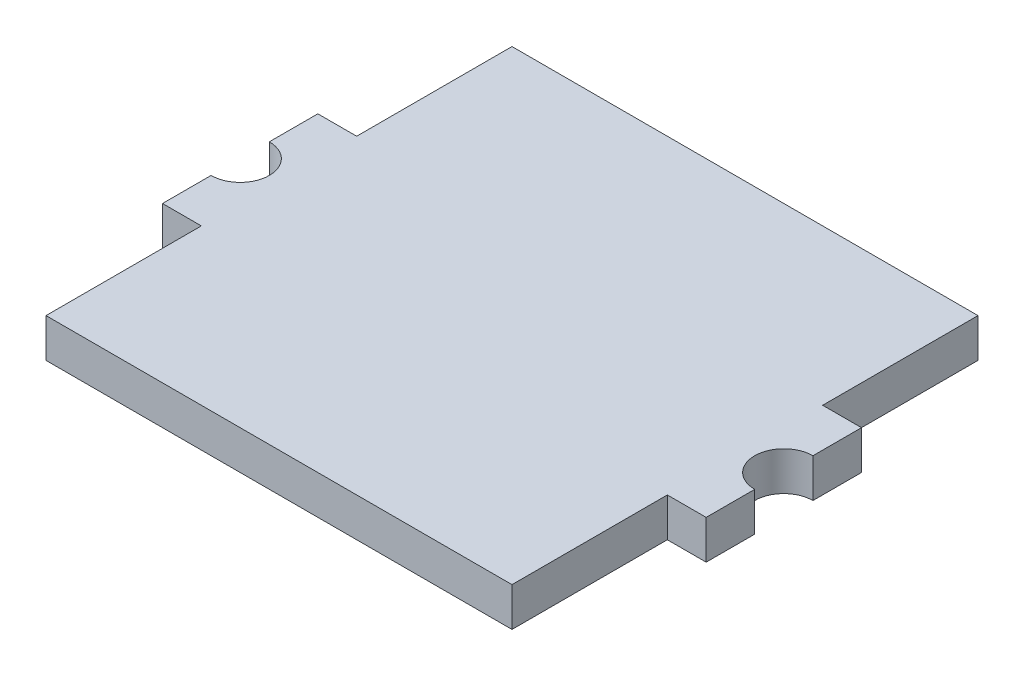
ISO-10303-21;
HEADER;
FILE_DESCRIPTION(('STEP AP214'),'2;1');
FILE_NAME('part.step','',(''),(''),'','','');
FILE_SCHEMA(('AUTOMOTIVE_DESIGN { 1 0 10303 214 1 1 1 1 }'));
ENDSEC;
DATA;
#1=APPLICATION_CONTEXT('core data for automotive mechanical design processes');
#2=APPLICATION_PROTOCOL_DEFINITION('international standard','automotive_design',2000,#1);
#3=PRODUCT_CONTEXT('',#1,'mechanical');
#4=PRODUCT('Part','Part','',(#3));
#5=PRODUCT_RELATED_PRODUCT_CATEGORY('part','',(#4));
#6=PRODUCT_DEFINITION_FORMATION('','',#4);
#7=PRODUCT_DEFINITION_CONTEXT('part definition',#1,'design');
#8=PRODUCT_DEFINITION('design','',#6,#7);
#9=PRODUCT_DEFINITION_SHAPE('','',#8);
#10=(LENGTH_UNIT() NAMED_UNIT(*) SI_UNIT(.MILLI.,.METRE.));
#11=(NAMED_UNIT(*) PLANE_ANGLE_UNIT() SI_UNIT($,.RADIAN.));
#12=(NAMED_UNIT(*) SI_UNIT($,.STERADIAN.) SOLID_ANGLE_UNIT());
#13=UNCERTAINTY_MEASURE_WITH_UNIT(LENGTH_MEASURE(1.E-05),#10,'distance_accuracy_value','');
#14=(GEOMETRIC_REPRESENTATION_CONTEXT(3) GLOBAL_UNCERTAINTY_ASSIGNED_CONTEXT((#13)) GLOBAL_UNIT_ASSIGNED_CONTEXT((#10,
#11,#12)) REPRESENTATION_CONTEXT('',''));
#15=CARTESIAN_POINT('',(0.,0.,0.));
#16=DIRECTION('',(0.,0.,1.));
#17=DIRECTION('',(1.,0.,0.));
#18=AXIS2_PLACEMENT_3D('',#15,#16,#17);
#19=CARTESIAN_POINT('',(38.1,3.175,0.));
#20=DIRECTION('',(0.,0.,-1.));
#21=DIRECTION('',(-1.,0.,0.));
#22=AXIS2_PLACEMENT_3D('',#19,#20,#21);
#23=PLANE('',#22);
#24=DIRECTION('',(1.,0.,0.));
#25=VECTOR('',#24,1.);
#26=CARTESIAN_POINT('',(38.1,0.,0.));
#27=LINE('',#26,#25);
#28=CARTESIAN_POINT('',(0.,0.,0.));
#29=VERTEX_POINT('',#28);
#30=CARTESIAN_POINT('',(38.1,0.,0.));
#31=VERTEX_POINT('',#30);
#32=EDGE_CURVE('E177',#29,#31,#27,.T.);
#33=ORIENTED_EDGE('',*,*,#32,.T.);
#34=DIRECTION('',(0.,-1.,0.));
#35=VECTOR('',#34,1.);
#36=CARTESIAN_POINT('',(38.1,3.175,0.));
#37=LINE('',#36,#35);
#38=CARTESIAN_POINT('',(38.1,3.175,0.));
#39=VERTEX_POINT('',#38);
#40=EDGE_CURVE('E11',#39,#31,#37,.T.);
#41=ORIENTED_EDGE('',*,*,#40,.F.);
#42=DIRECTION('',(1.,0.,0.));
#43=VECTOR('',#42,1.);
#44=CARTESIAN_POINT('',(38.1,3.175,0.));
#45=LINE('',#44,#43);
#46=CARTESIAN_POINT('',(0.,3.175,0.));
#47=VERTEX_POINT('',#46);
#48=EDGE_CURVE('E207',#47,#39,#45,.T.);
#49=ORIENTED_EDGE('',*,*,#48,.F.);
#50=DIRECTION('',(0.,-1.,0.));
#51=VECTOR('',#50,1.);
#52=CARTESIAN_POINT('',(0.,3.175,0.));
#53=LINE('',#52,#51);
#54=EDGE_CURVE('E173',#47,#29,#53,.T.);
#55=ORIENTED_EDGE('',*,*,#54,.T.);
#56=EDGE_LOOP('',(#33,#41,#49,#55));
#57=FACE_BOUND('',#56,.T.);
#58=ADVANCED_FACE('F33',(#57),#23,.F.);
#59=CARTESIAN_POINT('',(38.1,3.175,-12.7));
#60=DIRECTION('',(-1.,0.,0.));
#61=DIRECTION('',(0.,0.,1.));
#62=AXIS2_PLACEMENT_3D('',#59,#60,#61);
#63=PLANE('',#62);
#64=DIRECTION('',(0.,0.,-1.));
#65=VECTOR('',#64,1.);
#66=CARTESIAN_POINT('',(38.1,0.,-12.7));
#67=LINE('',#66,#65);
#68=CARTESIAN_POINT('',(38.1,0.,-12.7));
#69=VERTEX_POINT('',#68);
#70=EDGE_CURVE('E180',#31,#69,#67,.T.);
#71=ORIENTED_EDGE('',*,*,#70,.T.);
#72=DIRECTION('',(0.,-1.,0.));
#73=VECTOR('',#72,1.);
#74=CARTESIAN_POINT('',(38.1,3.175,-12.7));
#75=LINE('',#74,#73);
#76=CARTESIAN_POINT('',(38.1,3.175,-12.7));
#77=VERTEX_POINT('',#76);
#78=EDGE_CURVE('E41',#77,#69,#75,.T.);
#79=ORIENTED_EDGE('',*,*,#78,.F.);
#80=DIRECTION('',(0.,0.,-1.));
#81=VECTOR('',#80,1.);
#82=CARTESIAN_POINT('',(38.1,3.175,-12.7));
#83=LINE('',#82,#81);
#84=EDGE_CURVE('E116',#39,#77,#83,.T.);
#85=ORIENTED_EDGE('',*,*,#84,.F.);
#86=ORIENTED_EDGE('',*,*,#40,.T.);
#87=EDGE_LOOP('',(#71,#79,#85,#86));
#88=FACE_BOUND('',#87,.T.);
#89=ADVANCED_FACE('F305',(#88),#63,.F.);
#90=CARTESIAN_POINT('',(38.1,3.175,-12.7));
#91=DIRECTION('',(0.,0.,-1.));
#92=DIRECTION('',(-1.,0.,0.));
#93=AXIS2_PLACEMENT_3D('',#90,#91,#92);
#94=PLANE('',#93);
#95=DIRECTION('',(1.,0.,0.));
#96=VECTOR('',#95,1.);
#97=CARTESIAN_POINT('',(38.1,0.,-12.7));
#98=LINE('',#97,#96);
#99=CARTESIAN_POINT('',(41.275,0.,-12.7));
#100=VERTEX_POINT('',#99);
#101=EDGE_CURVE('E182',#69,#100,#98,.T.);
#102=ORIENTED_EDGE('',*,*,#101,.T.);
#103=DIRECTION('',(0.,-1.,0.));
#104=VECTOR('',#103,1.);
#105=CARTESIAN_POINT('',(41.275,3.175,-12.7));
#106=LINE('',#105,#104);
#107=CARTESIAN_POINT('',(41.275,3.175,-12.7));
#108=VERTEX_POINT('',#107);
#109=EDGE_CURVE('E238',#108,#100,#106,.T.);
#110=ORIENTED_EDGE('',*,*,#109,.F.);
#111=DIRECTION('',(1.,0.,0.));
#112=VECTOR('',#111,1.);
#113=CARTESIAN_POINT('',(38.1,3.175,-12.7));
#114=LINE('',#113,#112);
#115=EDGE_CURVE('E246',#77,#108,#114,.T.);
#116=ORIENTED_EDGE('',*,*,#115,.F.);
#117=ORIENTED_EDGE('',*,*,#78,.T.);
#118=EDGE_LOOP('',(#102,#110,#116,#117));
#119=FACE_BOUND('',#118,.T.);
#120=ADVANCED_FACE('F244',(#119),#94,.F.);
#121=CARTESIAN_POINT('',(41.275,3.175,-12.7));
#122=DIRECTION('',(-1.,0.,0.));
#123=DIRECTION('',(0.,0.,1.));
#124=AXIS2_PLACEMENT_3D('',#121,#122,#123);
#125=PLANE('',#124);
#126=DIRECTION('',(0.,0.,-1.));
#127=VECTOR('',#126,1.);
#128=CARTESIAN_POINT('',(41.275,0.,-12.7));
#129=LINE('',#128,#127);
#130=CARTESIAN_POINT('',(41.275,0.,-16.66875));
#131=VERTEX_POINT('',#130);
#132=EDGE_CURVE('E184',#100,#131,#129,.T.);
#133=ORIENTED_EDGE('',*,*,#132,.T.);
#134=DIRECTION('',(0.,-1.,0.));
#135=VECTOR('',#134,1.);
#136=CARTESIAN_POINT('',(41.275,3.175,-16.66875));
#137=LINE('',#136,#135);
#138=CARTESIAN_POINT('',(41.275,3.175,-16.66875));
#139=VERTEX_POINT('',#138);
#140=EDGE_CURVE('E235',#139,#131,#137,.T.);
#141=ORIENTED_EDGE('',*,*,#140,.F.);
#142=DIRECTION('',(0.,0.,-1.));
#143=VECTOR('',#142,1.);
#144=CARTESIAN_POINT('',(41.275,3.175,-12.7));
#145=LINE('',#144,#143);
#146=EDGE_CURVE('E264',#108,#139,#145,.T.);
#147=ORIENTED_EDGE('',*,*,#146,.F.);
#148=ORIENTED_EDGE('',*,*,#109,.T.);
#149=EDGE_LOOP('',(#133,#141,#147,#148));
#150=FACE_BOUND('',#149,.T.);
#151=ADVANCED_FACE('F255',(#150),#125,.F.);
#152=CARTESIAN_POINT('',(41.275,3.175,-19.05));
#153=DIRECTION('',(0.,-1.,0.));
#154=DIRECTION('',(0.,0.,-1.));
#155=AXIS2_PLACEMENT_3D('',#152,#153,#154);
#156=CYLINDRICAL_SURFACE('',#155,2.38125);
#157=CARTESIAN_POINT('',(41.275,0.,-19.05));
#158=DIRECTION('',(0.,-1.,0.));
#159=DIRECTION('',(0.,0.,-1.));
#160=AXIS2_PLACEMENT_3D('',#157,#158,#159);
#161=CIRCLE('',#160,2.38125);
#162=CARTESIAN_POINT('',(41.275,0.,-21.43125));
#163=VERTEX_POINT('',#162);
#164=EDGE_CURVE('E186',#131,#163,#161,.T.);
#165=ORIENTED_EDGE('',*,*,#164,.T.);
#166=DIRECTION('',(0.,-1.,0.));
#167=VECTOR('',#166,1.);
#168=CARTESIAN_POINT('',(41.275,3.175,-21.43125));
#169=LINE('',#168,#167);
#170=CARTESIAN_POINT('',(41.275,3.175,-21.43125));
#171=VERTEX_POINT('',#170);
#172=EDGE_CURVE('E232',#171,#163,#169,.T.);
#173=ORIENTED_EDGE('',*,*,#172,.F.);
#174=CARTESIAN_POINT('',(41.275,3.175,-19.05));
#175=DIRECTION('',(0.,-1.,0.));
#176=DIRECTION('',(0.,0.,-1.));
#177=AXIS2_PLACEMENT_3D('',#174,#175,#176);
#178=CIRCLE('',#177,2.38125);
#179=EDGE_CURVE('E261',#139,#171,#178,.T.);
#180=ORIENTED_EDGE('',*,*,#179,.F.);
#181=ORIENTED_EDGE('',*,*,#140,.T.);
#182=EDGE_LOOP('',(#165,#173,#180,#181));
#183=FACE_BOUND('',#182,.T.);
#184=ADVANCED_FACE('F259',(#183),#156,.F.);
#185=CARTESIAN_POINT('',(41.275,3.175,-21.43125));
#186=DIRECTION('',(-1.,0.,0.));
#187=DIRECTION('',(0.,0.,1.));
#188=AXIS2_PLACEMENT_3D('',#185,#186,#187);
#189=PLANE('',#188);
#190=DIRECTION('',(0.,0.,-1.));
#191=VECTOR('',#190,1.);
#192=CARTESIAN_POINT('',(41.275,0.,-21.43125));
#193=LINE('',#192,#191);
#194=CARTESIAN_POINT('',(41.275,0.,-25.4));
#195=VERTEX_POINT('',#194);
#196=EDGE_CURVE('E188',#163,#195,#193,.T.);
#197=ORIENTED_EDGE('',*,*,#196,.T.);
#198=DIRECTION('',(0.,-1.,0.));
#199=VECTOR('',#198,1.);
#200=CARTESIAN_POINT('',(41.275,3.175,-25.4));
#201=LINE('',#200,#199);
#202=CARTESIAN_POINT('',(41.275,3.175,-25.4));
#203=VERTEX_POINT('',#202);
#204=EDGE_CURVE('E229',#203,#195,#201,.T.);
#205=ORIENTED_EDGE('',*,*,#204,.F.);
#206=DIRECTION('',(0.,0.,-1.));
#207=VECTOR('',#206,1.);
#208=CARTESIAN_POINT('',(41.275,3.175,-21.43125));
#209=LINE('',#208,#207);
#210=EDGE_CURVE('E263',#171,#203,#209,.T.);
#211=ORIENTED_EDGE('',*,*,#210,.F.);
#212=ORIENTED_EDGE('',*,*,#172,.T.);
#213=EDGE_LOOP('',(#197,#205,#211,#212));
#214=FACE_BOUND('',#213,.T.);
#215=ADVANCED_FACE('F318',(#214),#189,.F.);
#216=CARTESIAN_POINT('',(41.275,3.175,-25.4));
#217=DIRECTION('',(0.,0.,1.));
#218=DIRECTION('',(1.,0.,0.));
#219=AXIS2_PLACEMENT_3D('',#216,#217,#218);
#220=PLANE('',#219);
#221=DIRECTION('',(-1.,0.,0.));
#222=VECTOR('',#221,1.);
#223=CARTESIAN_POINT('',(41.275,0.,-25.4));
#224=LINE('',#223,#222);
#225=CARTESIAN_POINT('',(38.1,0.,-25.4));
#226=VERTEX_POINT('',#225);
#227=EDGE_CURVE('E190',#195,#226,#224,.T.);
#228=ORIENTED_EDGE('',*,*,#227,.T.);
#229=DIRECTION('',(0.,-1.,0.));
#230=VECTOR('',#229,1.);
#231=CARTESIAN_POINT('',(38.1,3.175,-25.4));
#232=LINE('',#231,#230);
#233=CARTESIAN_POINT('',(38.1,3.175,-25.4));
#234=VERTEX_POINT('',#233);
#235=EDGE_CURVE('E226',#234,#226,#232,.T.);
#236=ORIENTED_EDGE('',*,*,#235,.F.);
#237=DIRECTION('',(-1.,0.,0.));
#238=VECTOR('',#237,1.);
#239=CARTESIAN_POINT('',(41.275,3.175,-25.4));
#240=LINE('',#239,#238);
#241=EDGE_CURVE('E266',#203,#234,#240,.T.);
#242=ORIENTED_EDGE('',*,*,#241,.F.);
#243=ORIENTED_EDGE('',*,*,#204,.T.);
#244=EDGE_LOOP('',(#228,#236,#242,#243));
#245=FACE_BOUND('',#244,.T.);
#246=ADVANCED_FACE('F321',(#245),#220,.F.);
#247=CARTESIAN_POINT('',(38.1,3.175,-38.1));
#248=DIRECTION('',(-1.,0.,0.));
#249=DIRECTION('',(0.,0.,1.));
#250=AXIS2_PLACEMENT_3D('',#247,#248,#249);
#251=PLANE('',#250);
#252=DIRECTION('',(0.,0.,-1.));
#253=VECTOR('',#252,1.);
#254=CARTESIAN_POINT('',(38.1,0.,-38.1));
#255=LINE('',#254,#253);
#256=CARTESIAN_POINT('',(38.1,0.,-38.1));
#257=VERTEX_POINT('',#256);
#258=EDGE_CURVE('E192',#226,#257,#255,.T.);
#259=ORIENTED_EDGE('',*,*,#258,.T.);
#260=DIRECTION('',(0.,-1.,0.));
#261=VECTOR('',#260,1.);
#262=CARTESIAN_POINT('',(38.1,3.175,-38.1));
#263=LINE('',#262,#261);
#264=CARTESIAN_POINT('',(38.1,3.175,-38.1));
#265=VERTEX_POINT('',#264);
#266=EDGE_CURVE('E223',#265,#257,#263,.T.);
#267=ORIENTED_EDGE('',*,*,#266,.F.);
#268=DIRECTION('',(0.,0.,-1.));
#269=VECTOR('',#268,1.);
#270=CARTESIAN_POINT('',(38.1,3.175,-38.1));
#271=LINE('',#270,#269);
#272=EDGE_CURVE('E272',#234,#265,#271,.T.);
#273=ORIENTED_EDGE('',*,*,#272,.F.);
#274=ORIENTED_EDGE('',*,*,#235,.T.);
#275=EDGE_LOOP('',(#259,#267,#273,#274));
#276=FACE_BOUND('',#275,.T.);
#277=ADVANCED_FACE('F325',(#276),#251,.F.);
#278=CARTESIAN_POINT('',(0.,3.175,-38.1));
#279=DIRECTION('',(0.,0.,1.));
#280=DIRECTION('',(1.,0.,0.));
#281=AXIS2_PLACEMENT_3D('',#278,#279,#280);
#282=PLANE('',#281);
#283=DIRECTION('',(-1.,0.,0.));
#284=VECTOR('',#283,1.);
#285=CARTESIAN_POINT('',(0.,0.,-38.1));
#286=LINE('',#285,#284);
#287=CARTESIAN_POINT('',(0.,0.,-38.1));
#288=VERTEX_POINT('',#287);
#289=EDGE_CURVE('E194',#257,#288,#286,.T.);
#290=ORIENTED_EDGE('',*,*,#289,.T.);
#291=DIRECTION('',(0.,-1.,0.));
#292=VECTOR('',#291,1.);
#293=CARTESIAN_POINT('',(0.,3.175,-38.1));
#294=LINE('',#293,#292);
#295=CARTESIAN_POINT('',(0.,3.175,-38.1));
#296=VERTEX_POINT('',#295);
#297=EDGE_CURVE('E220',#296,#288,#294,.T.);
#298=ORIENTED_EDGE('',*,*,#297,.F.);
#299=DIRECTION('',(-1.,0.,0.));
#300=VECTOR('',#299,1.);
#301=CARTESIAN_POINT('',(0.,3.175,-38.1));
#302=LINE('',#301,#300);
#303=EDGE_CURVE('E274',#265,#296,#302,.T.);
#304=ORIENTED_EDGE('',*,*,#303,.F.);
#305=ORIENTED_EDGE('',*,*,#266,.T.);
#306=EDGE_LOOP('',(#290,#298,#304,#305));
#307=FACE_BOUND('',#306,.T.);
#308=ADVANCED_FACE('F329',(#307),#282,.F.);
#309=CARTESIAN_POINT('',(0.,3.175,-25.4));
#310=DIRECTION('',(1.,0.,0.));
#311=DIRECTION('',(0.,0.,-1.));
#312=AXIS2_PLACEMENT_3D('',#309,#310,#311);
#313=PLANE('',#312);
#314=DIRECTION('',(0.,0.,1.));
#315=VECTOR('',#314,1.);
#316=CARTESIAN_POINT('',(0.,0.,-25.4));
#317=LINE('',#316,#315);
#318=CARTESIAN_POINT('',(0.,0.,-25.4));
#319=VERTEX_POINT('',#318);
#320=EDGE_CURVE('E196',#288,#319,#317,.T.);
#321=ORIENTED_EDGE('',*,*,#320,.T.);
#322=DIRECTION('',(0.,-1.,0.));
#323=VECTOR('',#322,1.);
#324=CARTESIAN_POINT('',(0.,3.175,-25.4));
#325=LINE('',#324,#323);
#326=CARTESIAN_POINT('',(0.,3.175,-25.4));
#327=VERTEX_POINT('',#326);
#328=EDGE_CURVE('E217',#327,#319,#325,.T.);
#329=ORIENTED_EDGE('',*,*,#328,.F.);
#330=DIRECTION('',(0.,0.,1.));
#331=VECTOR('',#330,1.);
#332=CARTESIAN_POINT('',(0.,3.175,-25.4));
#333=LINE('',#332,#331);
#334=EDGE_CURVE('E276',#296,#327,#333,.T.);
#335=ORIENTED_EDGE('',*,*,#334,.F.);
#336=ORIENTED_EDGE('',*,*,#297,.T.);
#337=EDGE_LOOP('',(#321,#329,#335,#336));
#338=FACE_BOUND('',#337,.T.);
#339=ADVANCED_FACE('F333',(#338),#313,.F.);
#340=CARTESIAN_POINT('',(0.,3.175,-25.4));
#341=DIRECTION('',(0.,0.,1.));
#342=DIRECTION('',(1.,0.,0.));
#343=AXIS2_PLACEMENT_3D('',#340,#341,#342);
#344=PLANE('',#343);
#345=DIRECTION('',(-1.,0.,0.));
#346=VECTOR('',#345,1.);
#347=CARTESIAN_POINT('',(0.,0.,-25.4));
#348=LINE('',#347,#346);
#349=CARTESIAN_POINT('',(-3.175,0.,-25.4));
#350=VERTEX_POINT('',#349);
#351=EDGE_CURVE('E198',#319,#350,#348,.T.);
#352=ORIENTED_EDGE('',*,*,#351,.T.);
#353=DIRECTION('',(0.,-1.,0.));
#354=VECTOR('',#353,1.);
#355=CARTESIAN_POINT('',(-3.175,3.175,-25.4));
#356=LINE('',#355,#354);
#357=CARTESIAN_POINT('',(-3.175,3.175,-25.4));
#358=VERTEX_POINT('',#357);
#359=EDGE_CURVE('E214',#358,#350,#356,.T.);
#360=ORIENTED_EDGE('',*,*,#359,.F.);
#361=DIRECTION('',(-1.,0.,0.));
#362=VECTOR('',#361,1.);
#363=CARTESIAN_POINT('',(0.,3.175,-25.4));
#364=LINE('',#363,#362);
#365=EDGE_CURVE('E278',#327,#358,#364,.T.);
#366=ORIENTED_EDGE('',*,*,#365,.F.);
#367=ORIENTED_EDGE('',*,*,#328,.T.);
#368=EDGE_LOOP('',(#352,#360,#366,#367));
#369=FACE_BOUND('',#368,.T.);
#370=ADVANCED_FACE('F337',(#369),#344,.F.);
#371=CARTESIAN_POINT('',(-3.175,3.175,-25.4));
#372=DIRECTION('',(1.,0.,0.));
#373=DIRECTION('',(0.,0.,-1.));
#374=AXIS2_PLACEMENT_3D('',#371,#372,#373);
#375=PLANE('',#374);
#376=DIRECTION('',(0.,0.,1.));
#377=VECTOR('',#376,1.);
#378=CARTESIAN_POINT('',(-3.175,0.,-25.4));
#379=LINE('',#378,#377);
#380=CARTESIAN_POINT('',(-3.175,0.,-21.43125));
#381=VERTEX_POINT('',#380);
#382=EDGE_CURVE('E200',#350,#381,#379,.T.);
#383=ORIENTED_EDGE('',*,*,#382,.T.);
#384=DIRECTION('',(0.,-1.,0.));
#385=VECTOR('',#384,1.);
#386=CARTESIAN_POINT('',(-3.175,3.175,-21.43125));
#387=LINE('',#386,#385);
#388=CARTESIAN_POINT('',(-3.175,3.175,-21.43125));
#389=VERTEX_POINT('',#388);
#390=EDGE_CURVE('E211',#389,#381,#387,.T.);
#391=ORIENTED_EDGE('',*,*,#390,.F.);
#392=DIRECTION('',(0.,0.,1.));
#393=VECTOR('',#392,1.);
#394=CARTESIAN_POINT('',(-3.175,3.175,-25.4));
#395=LINE('',#394,#393);
#396=EDGE_CURVE('E280',#358,#389,#395,.T.);
#397=ORIENTED_EDGE('',*,*,#396,.F.);
#398=ORIENTED_EDGE('',*,*,#359,.T.);
#399=EDGE_LOOP('',(#383,#391,#397,#398));
#400=FACE_BOUND('',#399,.T.);
#401=ADVANCED_FACE('F286',(#400),#375,.F.);
#402=CARTESIAN_POINT('',(-3.175,3.175,-19.05));
#403=DIRECTION('',(0.,-1.,0.));
#404=DIRECTION('',(0.,0.,-1.));
#405=AXIS2_PLACEMENT_3D('',#402,#403,#404);
#406=CYLINDRICAL_SURFACE('',#405,2.38125);
#407=CARTESIAN_POINT('',(-3.175,0.,-19.05));
#408=DIRECTION('',(0.,-1.,0.));
#409=DIRECTION('',(0.,0.,-1.));
#410=AXIS2_PLACEMENT_3D('',#407,#408,#409);
#411=CIRCLE('',#410,2.38125);
#412=CARTESIAN_POINT('',(-3.175,0.,-16.66875));
#413=VERTEX_POINT('',#412);
#414=EDGE_CURVE('E202',#381,#413,#411,.T.);
#415=ORIENTED_EDGE('',*,*,#414,.T.);
#416=DIRECTION('',(0.,-1.,0.));
#417=VECTOR('',#416,1.);
#418=CARTESIAN_POINT('',(-3.175,3.175,-16.66875));
#419=LINE('',#418,#417);
#420=CARTESIAN_POINT('',(-3.175,3.175,-16.66875));
#421=VERTEX_POINT('',#420);
#422=EDGE_CURVE('E168',#421,#413,#419,.T.);
#423=ORIENTED_EDGE('',*,*,#422,.F.);
#424=CARTESIAN_POINT('',(-3.175,3.175,-19.05));
#425=DIRECTION('',(0.,-1.,0.));
#426=DIRECTION('',(0.,0.,-1.));
#427=AXIS2_PLACEMENT_3D('',#424,#425,#426);
#428=CIRCLE('',#427,2.38125);
#429=EDGE_CURVE('E159',#389,#421,#428,.T.);
#430=ORIENTED_EDGE('',*,*,#429,.F.);
#431=ORIENTED_EDGE('',*,*,#390,.T.);
#432=EDGE_LOOP('',(#415,#423,#430,#431));
#433=FACE_BOUND('',#432,.T.);
#434=ADVANCED_FACE('F290',(#433),#406,.F.);
#435=CARTESIAN_POINT('',(-3.175,3.175,-16.66875));
#436=DIRECTION('',(1.,0.,0.));
#437=DIRECTION('',(0.,0.,-1.));
#438=AXIS2_PLACEMENT_3D('',#435,#436,#437);
#439=PLANE('',#438);
#440=DIRECTION('',(0.,0.,1.));
#441=VECTOR('',#440,1.);
#442=CARTESIAN_POINT('',(-3.175,0.,-16.66875));
#443=LINE('',#442,#441);
#444=CARTESIAN_POINT('',(-3.175,0.,-12.7));
#445=VERTEX_POINT('',#444);
#446=EDGE_CURVE('E167',#413,#445,#443,.T.);
#447=ORIENTED_EDGE('',*,*,#446,.T.);
#448=DIRECTION('',(0.,-1.,0.));
#449=VECTOR('',#448,1.);
#450=CARTESIAN_POINT('',(-3.175,3.175,-12.7));
#451=LINE('',#450,#449);
#452=CARTESIAN_POINT('',(-3.175,3.175,-12.7));
#453=VERTEX_POINT('',#452);
#454=EDGE_CURVE('E164',#453,#445,#451,.T.);
#455=ORIENTED_EDGE('',*,*,#454,.F.);
#456=DIRECTION('',(0.,0.,1.));
#457=VECTOR('',#456,1.);
#458=CARTESIAN_POINT('',(-3.175,3.175,-16.66875));
#459=LINE('',#458,#457);
#460=EDGE_CURVE('E153',#421,#453,#459,.T.);
#461=ORIENTED_EDGE('',*,*,#460,.F.);
#462=ORIENTED_EDGE('',*,*,#422,.T.);
#463=EDGE_LOOP('',(#447,#455,#461,#462));
#464=FACE_BOUND('',#463,.T.);
#465=ADVANCED_FACE('F165',(#464),#439,.F.);
#466=CARTESIAN_POINT('',(-3.175,3.175,-12.7));
#467=DIRECTION('',(0.,0.,-1.));
#468=DIRECTION('',(-1.,0.,0.));
#469=AXIS2_PLACEMENT_3D('',#466,#467,#468);
#470=PLANE('',#469);
#471=DIRECTION('',(1.,0.,0.));
#472=VECTOR('',#471,1.);
#473=CARTESIAN_POINT('',(-3.175,0.,-12.7));
#474=LINE('',#473,#472);
#475=CARTESIAN_POINT('',(0.,0.,-12.7));
#476=VERTEX_POINT('',#475);
#477=EDGE_CURVE('E102',#445,#476,#474,.T.);
#478=ORIENTED_EDGE('',*,*,#477,.T.);
#479=DIRECTION('',(0.,-1.,0.));
#480=VECTOR('',#479,1.);
#481=CARTESIAN_POINT('',(0.,3.175,-12.7));
#482=LINE('',#481,#480);
#483=CARTESIAN_POINT('',(0.,3.175,-12.7));
#484=VERTEX_POINT('',#483);
#485=EDGE_CURVE('E169',#484,#476,#482,.T.);
#486=ORIENTED_EDGE('',*,*,#485,.F.);
#487=DIRECTION('',(1.,0.,0.));
#488=VECTOR('',#487,1.);
#489=CARTESIAN_POINT('',(-3.175,3.175,-12.7));
#490=LINE('',#489,#488);
#491=EDGE_CURVE('E157',#453,#484,#490,.T.);
#492=ORIENTED_EDGE('',*,*,#491,.F.);
#493=ORIENTED_EDGE('',*,*,#454,.T.);
#494=EDGE_LOOP('',(#478,#486,#492,#493));
#495=FACE_BOUND('',#494,.T.);
#496=ADVANCED_FACE('F171',(#495),#470,.F.);
#497=CARTESIAN_POINT('',(0.,3.175,0.));
#498=DIRECTION('',(1.,0.,0.));
#499=DIRECTION('',(0.,0.,-1.));
#500=AXIS2_PLACEMENT_3D('',#497,#498,#499);
#501=PLANE('',#500);
#502=DIRECTION('',(0.,0.,1.));
#503=VECTOR('',#502,1.);
#504=CARTESIAN_POINT('',(0.,0.,0.));
#505=LINE('',#504,#503);
#506=EDGE_CURVE('E108',#476,#29,#505,.T.);
#507=ORIENTED_EDGE('',*,*,#506,.T.);
#508=ORIENTED_EDGE('',*,*,#54,.F.);
#509=DIRECTION('',(0.,0.,1.));
#510=VECTOR('',#509,1.);
#511=CARTESIAN_POINT('',(0.,3.175,0.));
#512=LINE('',#511,#510);
#513=EDGE_CURVE('E49',#484,#47,#512,.T.);
#514=ORIENTED_EDGE('',*,*,#513,.F.);
#515=ORIENTED_EDGE('',*,*,#485,.T.);
#516=EDGE_LOOP('',(#507,#508,#514,#515));
#517=FACE_BOUND('',#516,.T.);
#518=ADVANCED_FACE('F294',(#517),#501,.F.);
#519=CARTESIAN_POINT('',(-3.175,3.175,-19.05));
#520=DIRECTION('',(0.,-1.,0.));
#521=DIRECTION('',(0.,0.,-1.));
#522=AXIS2_PLACEMENT_3D('',#519,#520,#521);
#523=PLANE('',#522);
#524=ORIENTED_EDGE('',*,*,#48,.T.);
#525=ORIENTED_EDGE('',*,*,#84,.T.);
#526=ORIENTED_EDGE('',*,*,#115,.T.);
#527=ORIENTED_EDGE('',*,*,#146,.T.);
#528=ORIENTED_EDGE('',*,*,#179,.T.);
#529=ORIENTED_EDGE('',*,*,#210,.T.);
#530=ORIENTED_EDGE('',*,*,#241,.T.);
#531=ORIENTED_EDGE('',*,*,#272,.T.);
#532=ORIENTED_EDGE('',*,*,#303,.T.);
#533=ORIENTED_EDGE('',*,*,#334,.T.);
#534=ORIENTED_EDGE('',*,*,#365,.T.);
#535=ORIENTED_EDGE('',*,*,#396,.T.);
#536=ORIENTED_EDGE('',*,*,#429,.T.);
#537=ORIENTED_EDGE('',*,*,#460,.T.);
#538=ORIENTED_EDGE('',*,*,#491,.T.);
#539=ORIENTED_EDGE('',*,*,#513,.T.);
#540=EDGE_LOOP('',(#524,#525,#526,#527,#528,#529,#530,#531,#532,#533,#534,#535,#536,#537,#538,#539));
#541=FACE_BOUND('',#540,.T.);
#542=ADVANCED_FACE('F155',(#541),#523,.F.);
#543=CARTESIAN_POINT('',(-3.175,0.,-19.05));
#544=DIRECTION('',(0.,-1.,0.));
#545=DIRECTION('',(0.,0.,-1.));
#546=AXIS2_PLACEMENT_3D('',#543,#544,#545);
#547=PLANE('',#546);
#548=ORIENTED_EDGE('',*,*,#32,.F.);
#549=ORIENTED_EDGE('',*,*,#506,.F.);
#550=ORIENTED_EDGE('',*,*,#477,.F.);
#551=ORIENTED_EDGE('',*,*,#446,.F.);
#552=ORIENTED_EDGE('',*,*,#414,.F.);
#553=ORIENTED_EDGE('',*,*,#382,.F.);
#554=ORIENTED_EDGE('',*,*,#351,.F.);
#555=ORIENTED_EDGE('',*,*,#320,.F.);
#556=ORIENTED_EDGE('',*,*,#289,.F.);
#557=ORIENTED_EDGE('',*,*,#258,.F.);
#558=ORIENTED_EDGE('',*,*,#227,.F.);
#559=ORIENTED_EDGE('',*,*,#196,.F.);
#560=ORIENTED_EDGE('',*,*,#164,.F.);
#561=ORIENTED_EDGE('',*,*,#132,.F.);
#562=ORIENTED_EDGE('',*,*,#101,.F.);
#563=ORIENTED_EDGE('',*,*,#70,.F.);
#564=EDGE_LOOP('',(#548,#549,#550,#551,#552,#553,#554,#555,#556,#557,#558,#559,#560,#561,#562,#563));
#565=FACE_BOUND('',#564,.T.);
#566=ADVANCED_FACE('F250',(#565),#547,.T.);
#567=CLOSED_SHELL('',(#58,#89,#120,#151,#184,#215,#246,#277,#308,#339,#370,#401,#434,#465,#496,
#518,#542,#566));
#568=MANIFOLD_SOLID_BREP('B2',#567);
#569=ADVANCED_BREP_SHAPE_REPRESENTATION('',(#18,#568),#14);
#570=SHAPE_DEFINITION_REPRESENTATION(#9,#569);
ENDSEC;
END-ISO-10303-21;
